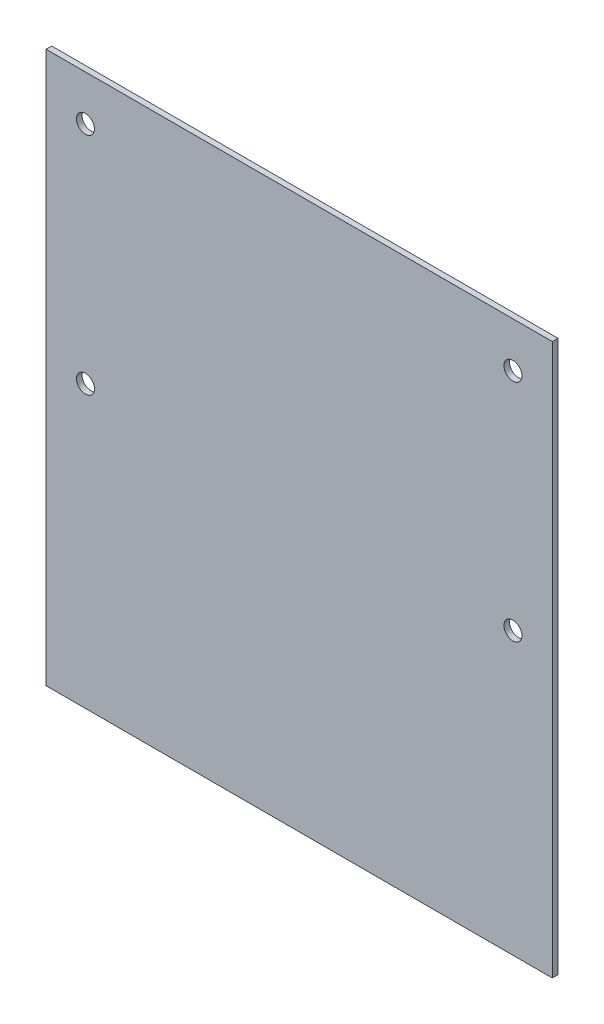
ISO-10303-21;
HEADER;
FILE_DESCRIPTION(('STEP AP214'),'2;1');
FILE_NAME('part.step','',(''),(''),'','','');
FILE_SCHEMA(('AUTOMOTIVE_DESIGN { 1 0 10303 214 1 1 1 1 }'));
ENDSEC;
DATA;
#1=APPLICATION_CONTEXT('core data for automotive mechanical design processes');
#2=APPLICATION_PROTOCOL_DEFINITION('international standard','automotive_design',2000,#1);
#3=PRODUCT_CONTEXT('',#1,'mechanical');
#4=PRODUCT('Part','Part','',(#3));
#5=PRODUCT_RELATED_PRODUCT_CATEGORY('part','',(#4));
#6=PRODUCT_DEFINITION_FORMATION('','',#4);
#7=PRODUCT_DEFINITION_CONTEXT('part definition',#1,'design');
#8=PRODUCT_DEFINITION('design','',#6,#7);
#9=PRODUCT_DEFINITION_SHAPE('','',#8);
#10=(LENGTH_UNIT() NAMED_UNIT(*) SI_UNIT(.MILLI.,.METRE.));
#11=(NAMED_UNIT(*) PLANE_ANGLE_UNIT() SI_UNIT($,.RADIAN.));
#12=(NAMED_UNIT(*) SI_UNIT($,.STERADIAN.) SOLID_ANGLE_UNIT());
#13=UNCERTAINTY_MEASURE_WITH_UNIT(LENGTH_MEASURE(1.E-05),#10,'distance_accuracy_value','');
#14=(GEOMETRIC_REPRESENTATION_CONTEXT(3) GLOBAL_UNCERTAINTY_ASSIGNED_CONTEXT((#13)) GLOBAL_UNIT_ASSIGNED_CONTEXT((#10,
#11,#12)) REPRESENTATION_CONTEXT('',''));
#15=CARTESIAN_POINT('',(0.,0.,0.));
#16=DIRECTION('',(0.,0.,1.));
#17=DIRECTION('',(1.,0.,0.));
#18=AXIS2_PLACEMENT_3D('',#15,#16,#17);
#19=CARTESIAN_POINT('',(0.,0.,1.));
#20=DIRECTION('',(1.,0.,0.));
#21=DIRECTION('',(0.,0.,-1.));
#22=AXIS2_PLACEMENT_3D('',#19,#20,#21);
#23=PLANE('',#22);
#24=DIRECTION('',(0.,-1.,0.));
#25=VECTOR('',#24,1.);
#26=CARTESIAN_POINT('',(0.,0.,0.));
#27=LINE('',#26,#25);
#28=CARTESIAN_POINT('',(0.,98.,0.));
#29=VERTEX_POINT('',#28);
#30=CARTESIAN_POINT('',(0.,0.,0.));
#31=VERTEX_POINT('',#30);
#32=EDGE_CURVE('E96',#29,#31,#27,.T.);
#33=ORIENTED_EDGE('',*,*,#32,.T.);
#34=DIRECTION('',(0.,0.,-1.));
#35=VECTOR('',#34,1.);
#36=CARTESIAN_POINT('',(0.,0.,1.));
#37=LINE('',#36,#35);
#38=CARTESIAN_POINT('',(0.,0.,1.));
#39=VERTEX_POINT('',#38);
#40=EDGE_CURVE('E11',#39,#31,#37,.T.);
#41=ORIENTED_EDGE('',*,*,#40,.F.);
#42=DIRECTION('',(0.,-1.,0.));
#43=VECTOR('',#42,1.);
#44=CARTESIAN_POINT('',(0.,0.,1.));
#45=LINE('',#44,#43);
#46=CARTESIAN_POINT('',(0.,98.,1.));
#47=VERTEX_POINT('',#46);
#48=EDGE_CURVE('E84',#47,#39,#45,.T.);
#49=ORIENTED_EDGE('',*,*,#48,.F.);
#50=DIRECTION('',(0.,0.,-1.));
#51=VECTOR('',#50,1.);
#52=CARTESIAN_POINT('',(0.,98.,1.));
#53=LINE('',#52,#51);
#54=EDGE_CURVE('E92',#47,#29,#53,.T.);
#55=ORIENTED_EDGE('',*,*,#54,.T.);
#56=EDGE_LOOP('',(#33,#41,#49,#55));
#57=FACE_BOUND('',#56,.T.);
#58=ADVANCED_FACE('F33',(#57),#23,.F.);
#59=CARTESIAN_POINT('',(0.,0.,1.));
#60=DIRECTION('',(0.,1.,0.));
#61=DIRECTION('',(0.,0.,1.));
#62=AXIS2_PLACEMENT_3D('',#59,#60,#61);
#63=PLANE('',#62);
#64=DIRECTION('',(1.,0.,0.));
#65=VECTOR('',#64,1.);
#66=CARTESIAN_POINT('',(0.,0.,0.));
#67=LINE('',#66,#65);
#68=CARTESIAN_POINT('',(90.,0.,0.));
#69=VERTEX_POINT('',#68);
#70=EDGE_CURVE('E88',#31,#69,#67,.T.);
#71=ORIENTED_EDGE('',*,*,#70,.T.);
#72=DIRECTION('',(0.,0.,-1.));
#73=VECTOR('',#72,1.);
#74=CARTESIAN_POINT('',(90.,0.,1.));
#75=LINE('',#74,#73);
#76=CARTESIAN_POINT('',(90.,0.,1.));
#77=VERTEX_POINT('',#76);
#78=EDGE_CURVE('E41',#77,#69,#75,.T.);
#79=ORIENTED_EDGE('',*,*,#78,.F.);
#80=DIRECTION('',(1.,0.,0.));
#81=VECTOR('',#80,1.);
#82=CARTESIAN_POINT('',(0.,0.,1.));
#83=LINE('',#82,#81);
#84=EDGE_CURVE('E79',#39,#77,#83,.T.);
#85=ORIENTED_EDGE('',*,*,#84,.F.);
#86=ORIENTED_EDGE('',*,*,#40,.T.);
#87=EDGE_LOOP('',(#71,#79,#85,#86));
#88=FACE_BOUND('',#87,.T.);
#89=ADVANCED_FACE('F87',(#88),#63,.F.);
#90=CARTESIAN_POINT('',(90.,0.,1.));
#91=DIRECTION('',(-1.,0.,0.));
#92=DIRECTION('',(0.,0.,1.));
#93=AXIS2_PLACEMENT_3D('',#90,#91,#92);
#94=PLANE('',#93);
#95=DIRECTION('',(0.,1.,0.));
#96=VECTOR('',#95,1.);
#97=CARTESIAN_POINT('',(90.,0.,0.));
#98=LINE('',#97,#96);
#99=CARTESIAN_POINT('',(90.,98.,0.));
#100=VERTEX_POINT('',#99);
#101=EDGE_CURVE('E66',#69,#100,#98,.T.);
#102=ORIENTED_EDGE('',*,*,#101,.T.);
#103=DIRECTION('',(0.,0.,-1.));
#104=VECTOR('',#103,1.);
#105=CARTESIAN_POINT('',(90.,98.,1.));
#106=LINE('',#105,#104);
#107=CARTESIAN_POINT('',(90.,98.,1.));
#108=VERTEX_POINT('',#107);
#109=EDGE_CURVE('E89',#108,#100,#106,.T.);
#110=ORIENTED_EDGE('',*,*,#109,.F.);
#111=DIRECTION('',(0.,1.,0.));
#112=VECTOR('',#111,1.);
#113=CARTESIAN_POINT('',(90.,0.,1.));
#114=LINE('',#113,#112);
#115=EDGE_CURVE('E82',#77,#108,#114,.T.);
#116=ORIENTED_EDGE('',*,*,#115,.F.);
#117=ORIENTED_EDGE('',*,*,#78,.T.);
#118=EDGE_LOOP('',(#102,#110,#116,#117));
#119=FACE_BOUND('',#118,.T.);
#120=ADVANCED_FACE('F90',(#119),#94,.F.);
#121=CARTESIAN_POINT('',(0.,98.,1.));
#122=DIRECTION('',(0.,-1.,0.));
#123=DIRECTION('',(0.,0.,-1.));
#124=AXIS2_PLACEMENT_3D('',#121,#122,#123);
#125=PLANE('',#124);
#126=DIRECTION('',(-1.,0.,0.));
#127=VECTOR('',#126,1.);
#128=CARTESIAN_POINT('',(0.,98.,0.));
#129=LINE('',#128,#127);
#130=EDGE_CURVE('E72',#100,#29,#129,.T.);
#131=ORIENTED_EDGE('',*,*,#130,.T.);
#132=ORIENTED_EDGE('',*,*,#54,.F.);
#133=DIRECTION('',(-1.,0.,0.));
#134=VECTOR('',#133,1.);
#135=CARTESIAN_POINT('',(0.,98.,1.));
#136=LINE('',#135,#134);
#137=EDGE_CURVE('E49',#108,#47,#136,.T.);
#138=ORIENTED_EDGE('',*,*,#137,.F.);
#139=ORIENTED_EDGE('',*,*,#109,.T.);
#140=EDGE_LOOP('',(#131,#132,#138,#139));
#141=FACE_BOUND('',#140,.T.);
#142=ADVANCED_FACE('F104',(#141),#125,.F.);
#143=CARTESIAN_POINT('',(0.,0.,1.));
#144=DIRECTION('',(0.,0.,-1.));
#145=DIRECTION('',(-1.,0.,0.));
#146=AXIS2_PLACEMENT_3D('',#143,#144,#145);
#147=PLANE('',#146);
#148=CARTESIAN_POINT('',(83.,50.,1.));
#149=DIRECTION('',(0.,0.,-1.));
#150=DIRECTION('',(-1.,0.,0.));
#151=AXIS2_PLACEMENT_3D('',#148,#149,#150);
#152=CIRCLE('',#151,1.60000000000001);
#153=CARTESIAN_POINT('',(81.4,50.,1.));
#154=VERTEX_POINT('',#153);
#155=EDGE_CURVE('E99',#154,#154,#152,.T.);
#156=ORIENTED_EDGE('',*,*,#155,.T.);
#157=EDGE_LOOP('',(#156));
#158=FACE_BOUND('',#157,.T.);
#159=CARTESIAN_POINT('',(83.,90.,1.));
#160=DIRECTION('',(0.,0.,-1.));
#161=DIRECTION('',(-1.,0.,0.));
#162=AXIS2_PLACEMENT_3D('',#159,#160,#161);
#163=CIRCLE('',#162,1.59999999999999);
#164=CARTESIAN_POINT('',(81.4,90.,1.));
#165=VERTEX_POINT('',#164);
#166=EDGE_CURVE('E112',#165,#165,#163,.T.);
#167=ORIENTED_EDGE('',*,*,#166,.T.);
#168=EDGE_LOOP('',(#167));
#169=FACE_BOUND('',#168,.T.);
#170=CARTESIAN_POINT('',(7.,90.,1.));
#171=DIRECTION('',(0.,0.,-1.));
#172=DIRECTION('',(-1.,0.,0.));
#173=AXIS2_PLACEMENT_3D('',#170,#171,#172);
#174=CIRCLE('',#173,1.6);
#175=CARTESIAN_POINT('',(5.4,90.,1.));
#176=VERTEX_POINT('',#175);
#177=EDGE_CURVE('E115',#176,#176,#174,.T.);
#178=ORIENTED_EDGE('',*,*,#177,.T.);
#179=EDGE_LOOP('',(#178));
#180=FACE_BOUND('',#179,.T.);
#181=CARTESIAN_POINT('',(7.,50.,1.));
#182=DIRECTION('',(0.,0.,-1.));
#183=DIRECTION('',(-1.,0.,0.));
#184=AXIS2_PLACEMENT_3D('',#181,#182,#183);
#185=CIRCLE('',#184,1.6);
#186=CARTESIAN_POINT('',(5.4,50.,1.));
#187=VERTEX_POINT('',#186);
#188=EDGE_CURVE('E118',#187,#187,#185,.T.);
#189=ORIENTED_EDGE('',*,*,#188,.T.);
#190=EDGE_LOOP('',(#189));
#191=FACE_BOUND('',#190,.T.);
#192=ORIENTED_EDGE('',*,*,#48,.T.);
#193=ORIENTED_EDGE('',*,*,#84,.T.);
#194=ORIENTED_EDGE('',*,*,#115,.T.);
#195=ORIENTED_EDGE('',*,*,#137,.T.);
#196=EDGE_LOOP('',(#192,#193,#194,#195));
#197=FACE_BOUND('',#196,.T.);
#198=ADVANCED_FACE('F80',(#158,#169,#180,#191,#197),#147,.F.);
#199=CARTESIAN_POINT('',(0.,0.,0.));
#200=DIRECTION('',(0.,0.,-1.));
#201=DIRECTION('',(-1.,0.,0.));
#202=AXIS2_PLACEMENT_3D('',#199,#200,#201);
#203=PLANE('',#202);
#204=CARTESIAN_POINT('',(83.,50.,0.));
#205=DIRECTION('',(0.,0.,1.));
#206=DIRECTION('',(-1.,0.,0.));
#207=AXIS2_PLACEMENT_3D('',#204,#205,#206);
#208=CIRCLE('',#207,1.60000000000001);
#209=CARTESIAN_POINT('',(81.4,50.,0.));
#210=VERTEX_POINT('',#209);
#211=EDGE_CURVE('E125',#210,#210,#208,.T.);
#212=ORIENTED_EDGE('',*,*,#211,.T.);
#213=EDGE_LOOP('',(#212));
#214=FACE_BOUND('',#213,.T.);
#215=CARTESIAN_POINT('',(83.,90.,0.));
#216=DIRECTION('',(0.,0.,1.));
#217=DIRECTION('',(-1.,0.,0.));
#218=AXIS2_PLACEMENT_3D('',#215,#216,#217);
#219=CIRCLE('',#218,1.59999999999999);
#220=CARTESIAN_POINT('',(81.4,90.,0.));
#221=VERTEX_POINT('',#220);
#222=EDGE_CURVE('E128',#221,#221,#219,.T.);
#223=ORIENTED_EDGE('',*,*,#222,.T.);
#224=EDGE_LOOP('',(#223));
#225=FACE_BOUND('',#224,.T.);
#226=CARTESIAN_POINT('',(7.,90.,0.));
#227=DIRECTION('',(0.,0.,1.));
#228=DIRECTION('',(1.,0.,0.));
#229=AXIS2_PLACEMENT_3D('',#226,#227,#228);
#230=CIRCLE('',#229,1.6);
#231=CARTESIAN_POINT('',(8.6,90.,0.));
#232=VERTEX_POINT('',#231);
#233=EDGE_CURVE('E124',#232,#232,#230,.T.);
#234=ORIENTED_EDGE('',*,*,#233,.T.);
#235=EDGE_LOOP('',(#234));
#236=FACE_BOUND('',#235,.T.);
#237=CARTESIAN_POINT('',(7.,50.,0.));
#238=DIRECTION('',(0.,0.,1.));
#239=DIRECTION('',(1.,0.,0.));
#240=AXIS2_PLACEMENT_3D('',#237,#238,#239);
#241=CIRCLE('',#240,1.6);
#242=CARTESIAN_POINT('',(8.6,50.,0.));
#243=VERTEX_POINT('',#242);
#244=EDGE_CURVE('E121',#243,#243,#241,.T.);
#245=ORIENTED_EDGE('',*,*,#244,.T.);
#246=EDGE_LOOP('',(#245));
#247=FACE_BOUND('',#246,.T.);
#248=ORIENTED_EDGE('',*,*,#32,.F.);
#249=ORIENTED_EDGE('',*,*,#130,.F.);
#250=ORIENTED_EDGE('',*,*,#101,.F.);
#251=ORIENTED_EDGE('',*,*,#70,.F.);
#252=EDGE_LOOP('',(#248,#249,#250,#251));
#253=FACE_BOUND('',#252,.T.);
#254=ADVANCED_FACE('F107',(#214,#225,#236,#247,#253),#203,.T.);
#255=CARTESIAN_POINT('',(7.,50.,0.));
#256=DIRECTION('',(0.,0.,1.));
#257=DIRECTION('',(1.,0.,0.));
#258=AXIS2_PLACEMENT_3D('',#255,#256,#257);
#259=CYLINDRICAL_SURFACE('',#258,1.6);
#260=ORIENTED_EDGE('',*,*,#244,.F.);
#261=EDGE_LOOP('',(#260));
#262=FACE_BOUND('',#261,.T.);
#263=ORIENTED_EDGE('',*,*,#188,.F.);
#264=EDGE_LOOP('',(#263));
#265=FACE_BOUND('',#264,.T.);
#266=ADVANCED_FACE('F140',(#262,#265),#259,.F.);
#267=CARTESIAN_POINT('',(7.,90.,0.));
#268=DIRECTION('',(0.,0.,1.));
#269=DIRECTION('',(1.,0.,0.));
#270=AXIS2_PLACEMENT_3D('',#267,#268,#269);
#271=CYLINDRICAL_SURFACE('',#270,1.6);
#272=ORIENTED_EDGE('',*,*,#233,.F.);
#273=EDGE_LOOP('',(#272));
#274=FACE_BOUND('',#273,.T.);
#275=ORIENTED_EDGE('',*,*,#177,.F.);
#276=EDGE_LOOP('',(#275));
#277=FACE_BOUND('',#276,.T.);
#278=ADVANCED_FACE('F136',(#274,#277),#271,.F.);
#279=CARTESIAN_POINT('',(83.,90.,0.));
#280=DIRECTION('',(0.,0.,1.));
#281=DIRECTION('',(1.,0.,0.));
#282=AXIS2_PLACEMENT_3D('',#279,#280,#281);
#283=CYLINDRICAL_SURFACE('',#282,1.59999999999999);
#284=ORIENTED_EDGE('',*,*,#222,.F.);
#285=EDGE_LOOP('',(#284));
#286=FACE_BOUND('',#285,.T.);
#287=ORIENTED_EDGE('',*,*,#166,.F.);
#288=EDGE_LOOP('',(#287));
#289=FACE_BOUND('',#288,.T.);
#290=ADVANCED_FACE('F139',(#286,#289),#283,.F.);
#291=CARTESIAN_POINT('',(83.,50.,0.));
#292=DIRECTION('',(0.,0.,1.));
#293=DIRECTION('',(1.,0.,0.));
#294=AXIS2_PLACEMENT_3D('',#291,#292,#293);
#295=CYLINDRICAL_SURFACE('',#294,1.60000000000001);
#296=ORIENTED_EDGE('',*,*,#211,.F.);
#297=EDGE_LOOP('',(#296));
#298=FACE_BOUND('',#297,.T.);
#299=ORIENTED_EDGE('',*,*,#155,.F.);
#300=EDGE_LOOP('',(#299));
#301=FACE_BOUND('',#300,.T.);
#302=ADVANCED_FACE('F201',(#298,#301),#295,.F.);
#303=CLOSED_SHELL('',(#58,#89,#120,#142,#198,#254,#266,#278,#290,#302));
#304=MANIFOLD_SOLID_BREP('B2',#303);
#305=ADVANCED_BREP_SHAPE_REPRESENTATION('',(#18,#304),#14);
#306=SHAPE_DEFINITION_REPRESENTATION(#9,#305);
ENDSEC;
END-ISO-10303-21;
